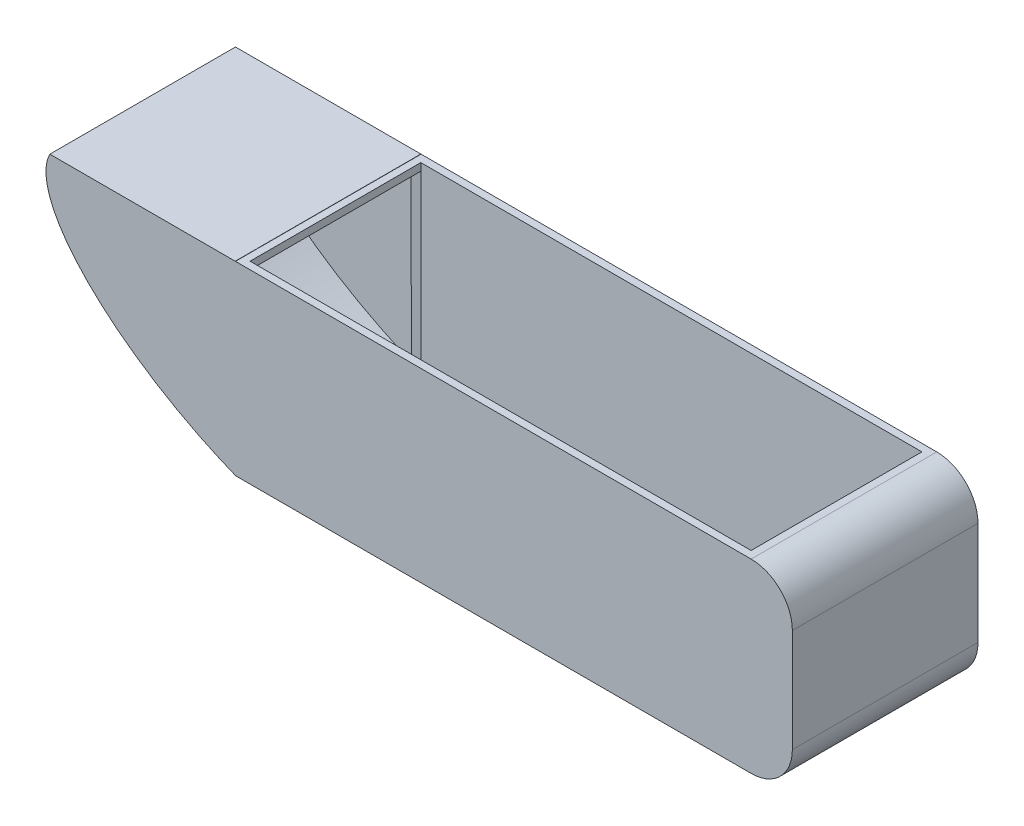
ISO-10303-21;
HEADER;
FILE_DESCRIPTION(('STEP AP214'),'2;1');
FILE_NAME('part.step','',(''),(''),'','','');
FILE_SCHEMA(('AUTOMOTIVE_DESIGN { 1 0 10303 214 1 1 1 1 }'));
ENDSEC;
DATA;
#1=APPLICATION_CONTEXT('core data for automotive mechanical design processes');
#2=APPLICATION_PROTOCOL_DEFINITION('international standard','automotive_design',2000,#1);
#3=PRODUCT_CONTEXT('',#1,'mechanical');
#4=PRODUCT('Part','Part','',(#3));
#5=PRODUCT_RELATED_PRODUCT_CATEGORY('part','',(#4));
#6=PRODUCT_DEFINITION_FORMATION('','',#4);
#7=PRODUCT_DEFINITION_CONTEXT('part definition',#1,'design');
#8=PRODUCT_DEFINITION('design','',#6,#7);
#9=PRODUCT_DEFINITION_SHAPE('','',#8);
#10=(LENGTH_UNIT() NAMED_UNIT(*) SI_UNIT(.MILLI.,.METRE.));
#11=(NAMED_UNIT(*) PLANE_ANGLE_UNIT() SI_UNIT($,.RADIAN.));
#12=(NAMED_UNIT(*) SI_UNIT($,.STERADIAN.) SOLID_ANGLE_UNIT());
#13=UNCERTAINTY_MEASURE_WITH_UNIT(LENGTH_MEASURE(1.E-05),#10,'distance_accuracy_value','');
#14=(GEOMETRIC_REPRESENTATION_CONTEXT(3) GLOBAL_UNCERTAINTY_ASSIGNED_CONTEXT((#13)) GLOBAL_UNIT_ASSIGNED_CONTEXT((#10,
#11,#12)) REPRESENTATION_CONTEXT('',''));
#15=CARTESIAN_POINT('',(0.,0.,0.));
#16=DIRECTION('',(0.,0.,1.));
#17=DIRECTION('',(1.,0.,0.));
#18=AXIS2_PLACEMENT_3D('',#15,#16,#17);
#19=CARTESIAN_POINT('',(0.,0.,250.));
#20=DIRECTION('',(-1.,0.,0.));
#21=DIRECTION('',(0.,0.,1.));
#22=AXIS2_PLACEMENT_3D('',#19,#20,#21);
#23=PLANE('',#22);
#24=DIRECTION('',(0.,1.,0.));
#25=VECTOR('',#24,1.);
#26=CARTESIAN_POINT('',(0.,0.,0.));
#27=LINE('',#26,#25);
#28=CARTESIAN_POINT('',(0.,249.866113842665,0.));
#29=VERTEX_POINT('',#28);
#30=CARTESIAN_POINT('',(0.,250.,0.));
#31=VERTEX_POINT('',#30);
#32=EDGE_CURVE('E215',#29,#31,#27,.T.);
#33=ORIENTED_EDGE('',*,*,#32,.F.);
#34=DIRECTION('',(0.,0.,-1.));
#35=VECTOR('',#34,1.);
#36=CARTESIAN_POINT('',(0.,249.866113842665,250.));
#37=LINE('',#36,#35);
#38=CARTESIAN_POINT('',(0.,249.866113842665,250.));
#39=VERTEX_POINT('',#38);
#40=EDGE_CURVE('E348',#39,#29,#37,.T.);
#41=ORIENTED_EDGE('',*,*,#40,.F.);
#42=DIRECTION('',(0.,1.,0.));
#43=VECTOR('',#42,1.);
#44=CARTESIAN_POINT('',(0.,0.,250.));
#45=LINE('',#44,#43);
#46=CARTESIAN_POINT('',(0.,250.,250.));
#47=VERTEX_POINT('',#46);
#48=EDGE_CURVE('E244',#39,#47,#45,.T.);
#49=ORIENTED_EDGE('',*,*,#48,.T.);
#50=DIRECTION('',(0.,0.,-1.));
#51=VECTOR('',#50,1.);
#52=CARTESIAN_POINT('',(0.,250.,250.));
#53=LINE('',#52,#51);
#54=EDGE_CURVE('E290',#47,#31,#53,.T.);
#55=ORIENTED_EDGE('',*,*,#54,.T.);
#56=EDGE_LOOP('',(#33,#41,#49,#55));
#57=FACE_BOUND('',#56,.T.);
#58=ADVANCED_FACE('F45',(#57),#23,.T.);
#59=CARTESIAN_POINT('',(0.,125.,250.));
#60=DIRECTION('',(0.,0.,1.));
#61=DIRECTION('',(-0.894427190999916,0.447213595499958,0.));
#62=AXIS2_PLACEMENT_3D('',#59,#60,#61);
#63=ELLIPSE('',#62,279.508497187474,113.981561352593);
#64=DIRECTION('',(0.,0.,-1.));
#65=VECTOR('',#64,1.);
#66=SURFACE_OF_LINEAR_EXTRUSION('',#63,#65);
#67=CARTESIAN_POINT('',(0.,125.,0.));
#68=DIRECTION('',(0.,0.,1.));
#69=DIRECTION('',(-0.894427190999916,0.447213595499958,0.));
#70=AXIS2_PLACEMENT_3D('',#67,#68,#69);
#71=ELLIPSE('',#70,279.508497187474,113.981561352593);
#72=CARTESIAN_POINT('',(-0.33480494875654,250.,0.));
#73=VERTEX_POINT('',#72);
#74=EDGE_CURVE('E294',#29,#73,#71,.T.);
#75=ORIENTED_EDGE('',*,*,#74,.T.);
#76=DIRECTION('',(0.,0.,-1.));
#77=VECTOR('',#76,1.);
#78=CARTESIAN_POINT('',(-0.33480494875654,250.,250.));
#79=LINE('',#78,#77);
#80=CARTESIAN_POINT('',(-0.33480494875654,250.,250.));
#81=VERTEX_POINT('',#80);
#82=EDGE_CURVE('E345',#81,#73,#79,.T.);
#83=ORIENTED_EDGE('',*,*,#82,.F.);
#84=EDGE_CURVE('E248',#39,#81,#63,.T.);
#85=ORIENTED_EDGE('',*,*,#84,.F.);
#86=ORIENTED_EDGE('',*,*,#40,.T.);
#87=EDGE_LOOP('',(#75,#83,#85,#86));
#88=FACE_BOUND('',#87,.T.);
#89=ADVANCED_FACE('F255',(#88),#66,.F.);
#90=CARTESIAN_POINT('',(0.,250.,250.));
#91=DIRECTION('',(0.,1.,0.));
#92=DIRECTION('',(0.,0.,1.));
#93=AXIS2_PLACEMENT_3D('',#90,#91,#92);
#94=PLANE('',#93);
#95=DIRECTION('',(1.,0.,0.));
#96=VECTOR('',#95,1.);
#97=CARTESIAN_POINT('',(0.,250.,0.));
#98=LINE('',#97,#96);
#99=CARTESIAN_POINT('',(-250.,250.,0.));
#100=VERTEX_POINT('',#99);
#101=EDGE_CURVE('E298',#100,#73,#98,.T.);
#102=ORIENTED_EDGE('',*,*,#101,.F.);
#103=DIRECTION('',(0.,0.,-1.));
#104=VECTOR('',#103,1.);
#105=CARTESIAN_POINT('',(-250.,250.,250.));
#106=LINE('',#105,#104);
#107=CARTESIAN_POINT('',(-250.,250.,250.));
#108=VERTEX_POINT('',#107);
#109=EDGE_CURVE('E342',#108,#100,#106,.T.);
#110=ORIENTED_EDGE('',*,*,#109,.F.);
#111=DIRECTION('',(1.,0.,0.));
#112=VECTOR('',#111,1.);
#113=CARTESIAN_POINT('',(0.,250.,250.));
#114=LINE('',#113,#112);
#115=EDGE_CURVE('E253',#108,#81,#114,.T.);
#116=ORIENTED_EDGE('',*,*,#115,.T.);
#117=ORIENTED_EDGE('',*,*,#82,.T.);
#118=EDGE_LOOP('',(#102,#110,#116,#117));
#119=FACE_BOUND('',#118,.T.);
#120=ADVANCED_FACE('F258',(#119),#94,.T.);
#121=CARTESIAN_POINT('',(0.,125.,250.));
#122=DIRECTION('',(0.,0.,1.));
#123=DIRECTION('',(-0.894427190999916,0.447213595499958,0.));
#124=AXIS2_PLACEMENT_3D('',#121,#122,#123);
#125=ELLIPSE('',#124,279.508497187474,113.981561352593);
#126=DIRECTION('',(0.,0.,-1.));
#127=VECTOR('',#126,1.);
#128=SURFACE_OF_LINEAR_EXTRUSION('',#125,#127);
#129=CARTESIAN_POINT('',(0.,125.,0.));
#130=DIRECTION('',(0.,0.,1.));
#131=DIRECTION('',(-0.894427190999916,0.447213595499958,0.));
#132=AXIS2_PLACEMENT_3D('',#129,#130,#131);
#133=ELLIPSE('',#132,279.508497187474,113.981561352593);
#134=CARTESIAN_POINT('',(0.33480494875654,0.,0.));
#135=VERTEX_POINT('',#134);
#136=EDGE_CURVE('E302',#100,#135,#133,.T.);
#137=ORIENTED_EDGE('',*,*,#136,.T.);
#138=DIRECTION('',(0.,0.,-1.));
#139=VECTOR('',#138,1.);
#140=CARTESIAN_POINT('',(0.33480494875654,0.,250.));
#141=LINE('',#140,#139);
#142=CARTESIAN_POINT('',(0.33480494875654,0.,250.));
#143=VERTEX_POINT('',#142);
#144=EDGE_CURVE('E338',#143,#135,#141,.T.);
#145=ORIENTED_EDGE('',*,*,#144,.F.);
#146=EDGE_CURVE('E269',#108,#143,#125,.T.);
#147=ORIENTED_EDGE('',*,*,#146,.F.);
#148=ORIENTED_EDGE('',*,*,#109,.T.);
#149=EDGE_LOOP('',(#137,#145,#147,#148));
#150=FACE_BOUND('',#149,.T.);
#151=ADVANCED_FACE('F262',(#150),#128,.F.);
#152=CARTESIAN_POINT('',(0.,0.,250.));
#153=DIRECTION('',(0.,1.,0.));
#154=DIRECTION('',(0.,0.,1.));
#155=AXIS2_PLACEMENT_3D('',#152,#153,#154);
#156=PLANE('',#155);
#157=DIRECTION('',(1.,0.,0.));
#158=VECTOR('',#157,1.);
#159=CARTESIAN_POINT('',(0.,0.,0.));
#160=LINE('',#159,#158);
#161=CARTESIAN_POINT('',(694.461299734421,0.,0.));
#162=VERTEX_POINT('',#161);
#163=EDGE_CURVE('E305',#135,#162,#160,.T.);
#164=ORIENTED_EDGE('',*,*,#163,.T.);
#165=DIRECTION('',(0.,0.,-1.));
#166=VECTOR('',#165,1.);
#167=CARTESIAN_POINT('',(694.461299734421,0.,250.));
#168=LINE('',#167,#166);
#169=CARTESIAN_POINT('',(694.461299734421,0.,250.));
#170=VERTEX_POINT('',#169);
#171=EDGE_CURVE('E334',#170,#162,#168,.T.);
#172=ORIENTED_EDGE('',*,*,#171,.F.);
#173=DIRECTION('',(1.,0.,0.));
#174=VECTOR('',#173,1.);
#175=CARTESIAN_POINT('',(0.,0.,250.));
#176=LINE('',#175,#174);
#177=EDGE_CURVE('E273',#143,#170,#176,.T.);
#178=ORIENTED_EDGE('',*,*,#177,.F.);
#179=ORIENTED_EDGE('',*,*,#144,.T.);
#180=EDGE_LOOP('',(#164,#172,#178,#179));
#181=FACE_BOUND('',#180,.T.);
#182=ADVANCED_FACE('F266',(#181),#156,.F.);
#183=CARTESIAN_POINT('',(694.461299734421,55.538700265579,250.));
#184=DIRECTION('',(0.,0.,-1.));
#185=DIRECTION('',(-1.,0.,0.));
#186=AXIS2_PLACEMENT_3D('',#183,#184,#185);
#187=CYLINDRICAL_SURFACE('',#186,55.538700265579);
#188=CARTESIAN_POINT('',(694.461299734421,55.538700265579,0.));
#189=DIRECTION('',(0.,0.,1.));
#190=DIRECTION('',(1.,0.,0.));
#191=AXIS2_PLACEMENT_3D('',#188,#189,#190);
#192=CIRCLE('',#191,55.538700265579);
#193=CARTESIAN_POINT('',(750.,55.5387002655794,0.));
#194=VERTEX_POINT('',#193);
#195=EDGE_CURVE('E308',#162,#194,#192,.T.);
#196=ORIENTED_EDGE('',*,*,#195,.T.);
#197=DIRECTION('',(0.,0.,-1.));
#198=VECTOR('',#197,1.);
#199=CARTESIAN_POINT('',(750.,55.5387002655794,250.));
#200=LINE('',#199,#198);
#201=CARTESIAN_POINT('',(750.,55.5387002655794,250.));
#202=VERTEX_POINT('',#201);
#203=EDGE_CURVE('E330',#202,#194,#200,.T.);
#204=ORIENTED_EDGE('',*,*,#203,.F.);
#205=CARTESIAN_POINT('',(694.461299734421,55.538700265579,250.));
#206=DIRECTION('',(0.,0.,1.));
#207=DIRECTION('',(1.,0.,0.));
#208=AXIS2_PLACEMENT_3D('',#205,#206,#207);
#209=CIRCLE('',#208,55.538700265579);
#210=EDGE_CURVE('E276',#170,#202,#209,.T.);
#211=ORIENTED_EDGE('',*,*,#210,.F.);
#212=ORIENTED_EDGE('',*,*,#171,.T.);
#213=EDGE_LOOP('',(#196,#204,#211,#212));
#214=FACE_BOUND('',#213,.T.);
#215=ADVANCED_FACE('F454',(#214),#187,.T.);
#216=CARTESIAN_POINT('',(750.,0.,250.));
#217=DIRECTION('',(-1.,0.,0.));
#218=DIRECTION('',(0.,0.,1.));
#219=AXIS2_PLACEMENT_3D('',#216,#217,#218);
#220=PLANE('',#219);
#221=DIRECTION('',(0.,1.,0.));
#222=VECTOR('',#221,1.);
#223=CARTESIAN_POINT('',(750.,0.,0.));
#224=LINE('',#223,#222);
#225=CARTESIAN_POINT('',(750.,194.461299734421,0.));
#226=VERTEX_POINT('',#225);
#227=EDGE_CURVE('E311',#194,#226,#224,.T.);
#228=ORIENTED_EDGE('',*,*,#227,.T.);
#229=DIRECTION('',(0.,0.,-1.));
#230=VECTOR('',#229,1.);
#231=CARTESIAN_POINT('',(750.,194.461299734421,250.));
#232=LINE('',#231,#230);
#233=CARTESIAN_POINT('',(750.,194.461299734421,250.));
#234=VERTEX_POINT('',#233);
#235=EDGE_CURVE('E327',#234,#226,#232,.T.);
#236=ORIENTED_EDGE('',*,*,#235,.F.);
#237=DIRECTION('',(0.,1.,0.));
#238=VECTOR('',#237,1.);
#239=CARTESIAN_POINT('',(750.,0.,250.));
#240=LINE('',#239,#238);
#241=EDGE_CURVE('E279',#202,#234,#240,.T.);
#242=ORIENTED_EDGE('',*,*,#241,.F.);
#243=ORIENTED_EDGE('',*,*,#203,.T.);
#244=EDGE_LOOP('',(#228,#236,#242,#243));
#245=FACE_BOUND('',#244,.T.);
#246=ADVANCED_FACE('F451',(#245),#220,.F.);
#247=CARTESIAN_POINT('',(694.461299734421,194.461299734421,250.));
#248=DIRECTION('',(0.,0.,-1.));
#249=DIRECTION('',(-1.,0.,0.));
#250=AXIS2_PLACEMENT_3D('',#247,#248,#249);
#251=CYLINDRICAL_SURFACE('',#250,55.538700265579);
#252=CARTESIAN_POINT('',(694.461299734421,194.461299734421,0.));
#253=DIRECTION('',(0.,0.,1.));
#254=DIRECTION('',(1.,0.,0.));
#255=AXIS2_PLACEMENT_3D('',#252,#253,#254);
#256=CIRCLE('',#255,55.538700265579);
#257=CARTESIAN_POINT('',(694.461299734421,250.,0.));
#258=VERTEX_POINT('',#257);
#259=EDGE_CURVE('E315',#258,#226,#256,.F.);
#260=ORIENTED_EDGE('',*,*,#259,.F.);
#261=DIRECTION('',(0.,0.,-1.));
#262=VECTOR('',#261,1.);
#263=CARTESIAN_POINT('',(694.461299734421,250.,250.));
#264=LINE('',#263,#262);
#265=CARTESIAN_POINT('',(694.461299734421,250.,250.));
#266=VERTEX_POINT('',#265);
#267=EDGE_CURVE('E324',#266,#258,#264,.T.);
#268=ORIENTED_EDGE('',*,*,#267,.F.);
#269=CARTESIAN_POINT('',(694.461299734421,194.461299734421,250.));
#270=DIRECTION('',(0.,0.,1.));
#271=DIRECTION('',(1.,0.,0.));
#272=AXIS2_PLACEMENT_3D('',#269,#270,#271);
#273=CIRCLE('',#272,55.538700265579);
#274=EDGE_CURVE('E282',#266,#234,#273,.F.);
#275=ORIENTED_EDGE('',*,*,#274,.T.);
#276=ORIENTED_EDGE('',*,*,#235,.T.);
#277=EDGE_LOOP('',(#260,#268,#275,#276));
#278=FACE_BOUND('',#277,.T.);
#279=ADVANCED_FACE('F447',(#278),#251,.T.);
#280=CARTESIAN_POINT('',(0.,250.,250.));
#281=DIRECTION('',(0.,1.,0.));
#282=DIRECTION('',(0.,0.,1.));
#283=AXIS2_PLACEMENT_3D('',#280,#281,#282);
#284=PLANE('',#283);
#285=DIRECTION('',(0.,0.,1.));
#286=VECTOR('',#285,1.);
#287=CARTESIAN_POINT('',(9.66519505124346,250.,10.));
#288=LINE('',#287,#286);
#289=CARTESIAN_POINT('',(9.66519505124346,250.,10.));
#290=VERTEX_POINT('',#289);
#291=CARTESIAN_POINT('',(9.66519505124349,250.,240.));
#292=VERTEX_POINT('',#291);
#293=EDGE_CURVE('E711',#290,#292,#288,.T.);
#294=ORIENTED_EDGE('',*,*,#293,.F.);
#295=DIRECTION('',(-1.,0.,0.));
#296=VECTOR('',#295,1.);
#297=CARTESIAN_POINT('',(9.66519505124346,250.,10.));
#298=LINE('',#297,#296);
#299=CARTESIAN_POINT('',(684.461299734421,250.,10.));
#300=VERTEX_POINT('',#299);
#301=EDGE_CURVE('E225',#300,#290,#298,.T.);
#302=ORIENTED_EDGE('',*,*,#301,.F.);
#303=DIRECTION('',(0.,0.,-1.));
#304=VECTOR('',#303,1.);
#305=CARTESIAN_POINT('',(684.461299734421,250.,10.));
#306=LINE('',#305,#304);
#307=CARTESIAN_POINT('',(684.461299734421,250.,240.));
#308=VERTEX_POINT('',#307);
#309=EDGE_CURVE('E756',#308,#300,#306,.T.);
#310=ORIENTED_EDGE('',*,*,#309,.F.);
#311=DIRECTION('',(1.,0.,0.));
#312=VECTOR('',#311,1.);
#313=CARTESIAN_POINT('',(9.66519505124349,250.,240.));
#314=LINE('',#313,#312);
#315=EDGE_CURVE('E754',#292,#308,#314,.T.);
#316=ORIENTED_EDGE('',*,*,#315,.F.);
#317=EDGE_LOOP('',(#294,#302,#310,#316));
#318=FACE_BOUND('',#317,.T.);
#319=DIRECTION('',(1.,0.,0.));
#320=VECTOR('',#319,1.);
#321=CARTESIAN_POINT('',(0.,250.,0.));
#322=LINE('',#321,#320);
#323=EDGE_CURVE('E249',#31,#258,#322,.T.);
#324=ORIENTED_EDGE('',*,*,#323,.F.);
#325=ORIENTED_EDGE('',*,*,#54,.F.);
#326=DIRECTION('',(1.,0.,0.));
#327=VECTOR('',#326,1.);
#328=CARTESIAN_POINT('',(0.,250.,250.));
#329=LINE('',#328,#327);
#330=EDGE_CURVE('E286',#47,#266,#329,.T.);
#331=ORIENTED_EDGE('',*,*,#330,.T.);
#332=ORIENTED_EDGE('',*,*,#267,.T.);
#333=EDGE_LOOP('',(#324,#325,#331,#332));
#334=FACE_BOUND('',#333,.T.);
#335=ADVANCED_FACE('F440',(#318,#334),#284,.T.);
#336=CARTESIAN_POINT('',(0.,0.,250.));
#337=DIRECTION('',(0.,0.,1.));
#338=DIRECTION('',(1.,0.,0.));
#339=AXIS2_PLACEMENT_3D('',#336,#337,#338);
#340=PLANE('',#339);
#341=ORIENTED_EDGE('',*,*,#48,.F.);
#342=ORIENTED_EDGE('',*,*,#84,.T.);
#343=ORIENTED_EDGE('',*,*,#115,.F.);
#344=ORIENTED_EDGE('',*,*,#146,.T.);
#345=ORIENTED_EDGE('',*,*,#177,.T.);
#346=ORIENTED_EDGE('',*,*,#210,.T.);
#347=ORIENTED_EDGE('',*,*,#241,.T.);
#348=ORIENTED_EDGE('',*,*,#274,.F.);
#349=ORIENTED_EDGE('',*,*,#330,.F.);
#350=EDGE_LOOP('',(#341,#342,#343,#344,#345,#346,#347,#348,#349));
#351=FACE_BOUND('',#350,.T.);
#352=ADVANCED_FACE('F437',(#351),#340,.T.);
#353=CARTESIAN_POINT('',(0.,0.,0.));
#354=DIRECTION('',(0.,0.,1.));
#355=DIRECTION('',(1.,0.,0.));
#356=AXIS2_PLACEMENT_3D('',#353,#354,#355);
#357=PLANE('',#356);
#358=ORIENTED_EDGE('',*,*,#32,.T.);
#359=ORIENTED_EDGE('',*,*,#323,.T.);
#360=ORIENTED_EDGE('',*,*,#259,.T.);
#361=ORIENTED_EDGE('',*,*,#227,.F.);
#362=ORIENTED_EDGE('',*,*,#195,.F.);
#363=ORIENTED_EDGE('',*,*,#163,.F.);
#364=ORIENTED_EDGE('',*,*,#136,.F.);
#365=ORIENTED_EDGE('',*,*,#101,.T.);
#366=ORIENTED_EDGE('',*,*,#74,.F.);
#367=EDGE_LOOP('',(#358,#359,#360,#361,#362,#363,#364,#365,#366));
#368=FACE_BOUND('',#367,.T.);
#369=ADVANCED_FACE('F436',(#368),#357,.F.);
#370=CARTESIAN_POINT('',(9.66519505124346,10.,10.));
#371=DIRECTION('',(-1.,0.,0.));
#372=DIRECTION('',(0.,0.,1.));
#373=AXIS2_PLACEMENT_3D('',#370,#371,#372);
#374=PLANE('',#373);
#375=DIRECTION('',(0.,1.,0.));
#376=VECTOR('',#375,1.);
#377=CARTESIAN_POINT('',(9.66519505124349,10.,240.));
#378=LINE('',#377,#376);
#379=CARTESIAN_POINT('',(9.66519505124349,240.,240.));
#380=VERTEX_POINT('',#379);
#381=EDGE_CURVE('E68',#380,#292,#378,.T.);
#382=ORIENTED_EDGE('',*,*,#381,.F.);
#383=DIRECTION('',(0.,0.,1.));
#384=VECTOR('',#383,1.);
#385=CARTESIAN_POINT('',(9.66519505124346,240.,10.0000000000001));
#386=LINE('',#385,#384);
#387=CARTESIAN_POINT('',(9.66519505124346,240.,10.0000000000001));
#388=VERTEX_POINT('',#387);
#389=EDGE_CURVE('E198',#388,#380,#386,.T.);
#390=ORIENTED_EDGE('',*,*,#389,.F.);
#391=DIRECTION('',(0.,1.,0.));
#392=VECTOR('',#391,1.);
#393=CARTESIAN_POINT('',(9.66519505124346,10.,10.));
#394=LINE('',#393,#392);
#395=EDGE_CURVE('E216',#388,#290,#394,.T.);
#396=ORIENTED_EDGE('',*,*,#395,.T.);
#397=ORIENTED_EDGE('',*,*,#293,.T.);
#398=EDGE_LOOP('',(#382,#390,#396,#397));
#399=FACE_BOUND('',#398,.T.);
#400=ADVANCED_FACE('F219',(#399),#374,.F.);
#401=CARTESIAN_POINT('',(9.66519505124346,10.,10.));
#402=DIRECTION('',(0.,0.,-1.));
#403=DIRECTION('',(-1.,0.,0.));
#404=AXIS2_PLACEMENT_3D('',#401,#402,#403);
#405=PLANE('',#404);
#406=ORIENTED_EDGE('',*,*,#301,.T.);
#407=ORIENTED_EDGE('',*,*,#395,.F.);
#408=CARTESIAN_POINT('',(9.66519505124346,10.,10.0000000000001));
#409=VERTEX_POINT('',#408);
#410=EDGE_CURVE('E205',#409,#388,#394,.T.);
#411=ORIENTED_EDGE('',*,*,#410,.F.);
#412=DIRECTION('',(-1.,0.,0.));
#413=VECTOR('',#412,1.);
#414=CARTESIAN_POINT('',(9.66519505124346,10.,10.));
#415=LINE('',#414,#413);
#416=CARTESIAN_POINT('',(684.461299734421,10.,10.));
#417=VERTEX_POINT('',#416);
#418=EDGE_CURVE('E749',#417,#409,#415,.T.);
#419=ORIENTED_EDGE('',*,*,#418,.F.);
#420=DIRECTION('',(0.,1.,0.));
#421=VECTOR('',#420,1.);
#422=CARTESIAN_POINT('',(684.461299734421,10.,10.));
#423=LINE('',#422,#421);
#424=CARTESIAN_POINT('',(684.461299734421,240.,9.99999999999999));
#425=VERTEX_POINT('',#424);
#426=EDGE_CURVE('E228',#417,#425,#423,.T.);
#427=ORIENTED_EDGE('',*,*,#426,.T.);
#428=EDGE_CURVE('E231',#425,#300,#423,.T.);
#429=ORIENTED_EDGE('',*,*,#428,.T.);
#430=EDGE_LOOP('',(#406,#407,#411,#419,#427,#429));
#431=FACE_BOUND('',#430,.T.);
#432=ADVANCED_FACE('F223',(#431),#405,.F.);
#433=CARTESIAN_POINT('',(684.461299734421,10.,10.));
#434=DIRECTION('',(1.,0.,0.));
#435=DIRECTION('',(0.,0.,-1.));
#436=AXIS2_PLACEMENT_3D('',#433,#434,#435);
#437=PLANE('',#436);
#438=ORIENTED_EDGE('',*,*,#428,.F.);
#439=DIRECTION('',(0.,0.,-1.));
#440=VECTOR('',#439,1.);
#441=CARTESIAN_POINT('',(684.461299734421,240.,9.99999999999999));
#442=LINE('',#441,#440);
#443=CARTESIAN_POINT('',(684.461299734421,240.,240.));
#444=VERTEX_POINT('',#443);
#445=EDGE_CURVE('E698',#444,#425,#442,.T.);
#446=ORIENTED_EDGE('',*,*,#445,.F.);
#447=DIRECTION('',(0.,1.,0.));
#448=VECTOR('',#447,1.);
#449=CARTESIAN_POINT('',(684.461299734421,10.,240.));
#450=LINE('',#449,#448);
#451=EDGE_CURVE('E240',#444,#308,#450,.T.);
#452=ORIENTED_EDGE('',*,*,#451,.T.);
#453=ORIENTED_EDGE('',*,*,#309,.T.);
#454=EDGE_LOOP('',(#438,#446,#452,#453));
#455=FACE_BOUND('',#454,.T.);
#456=ADVANCED_FACE('F428',(#455),#437,.F.);
#457=CARTESIAN_POINT('',(9.66519505124349,10.,240.));
#458=DIRECTION('',(0.,0.,1.));
#459=DIRECTION('',(1.,0.,0.));
#460=AXIS2_PLACEMENT_3D('',#457,#458,#459);
#461=PLANE('',#460);
#462=ORIENTED_EDGE('',*,*,#315,.T.);
#463=ORIENTED_EDGE('',*,*,#451,.F.);
#464=CARTESIAN_POINT('',(684.461299734421,10.,240.));
#465=VERTEX_POINT('',#464);
#466=EDGE_CURVE('E236',#465,#444,#450,.T.);
#467=ORIENTED_EDGE('',*,*,#466,.F.);
#468=DIRECTION('',(1.,0.,0.));
#469=VECTOR('',#468,1.);
#470=CARTESIAN_POINT('',(9.66519505124349,10.,240.));
#471=LINE('',#470,#469);
#472=CARTESIAN_POINT('',(9.66519505124349,10.,240.));
#473=VERTEX_POINT('',#472);
#474=EDGE_CURVE('E741',#473,#465,#471,.T.);
#475=ORIENTED_EDGE('',*,*,#474,.F.);
#476=EDGE_CURVE('E241',#473,#380,#378,.T.);
#477=ORIENTED_EDGE('',*,*,#476,.T.);
#478=ORIENTED_EDGE('',*,*,#381,.T.);
#479=EDGE_LOOP('',(#462,#463,#467,#475,#477,#478));
#480=FACE_BOUND('',#479,.T.);
#481=ADVANCED_FACE('F424',(#480),#461,.F.);
#482=CARTESIAN_POINT('',(0.,10.,0.));
#483=DIRECTION('',(0.,1.,0.));
#484=DIRECTION('',(0.,0.,1.));
#485=AXIS2_PLACEMENT_3D('',#482,#483,#484);
#486=PLANE('',#485);
#487=DIRECTION('',(0.,0.,1.));
#488=VECTOR('',#487,1.);
#489=CARTESIAN_POINT('',(9.66519505124346,10.,10.));
#490=LINE('',#489,#488);
#491=EDGE_CURVE('E737',#409,#473,#490,.T.);
#492=ORIENTED_EDGE('',*,*,#491,.T.);
#493=ORIENTED_EDGE('',*,*,#474,.T.);
#494=DIRECTION('',(0.,0.,-1.));
#495=VECTOR('',#494,1.);
#496=CARTESIAN_POINT('',(684.461299734421,10.,10.));
#497=LINE('',#496,#495);
#498=EDGE_CURVE('E745',#465,#417,#497,.T.);
#499=ORIENTED_EDGE('',*,*,#498,.T.);
#500=ORIENTED_EDGE('',*,*,#418,.T.);
#501=EDGE_LOOP('',(#492,#493,#499,#500));
#502=FACE_BOUND('',#501,.T.);
#503=ADVANCED_FACE('F410',(#502),#486,.T.);
#504=CARTESIAN_POINT('',(684.461299734421,240.,9.99999999999999));
#505=DIRECTION('',(0.913545457642601,0.,-0.406736643075799));
#506=DIRECTION('',(-0.406736643075799,0.,-0.913545457642601));
#507=AXIS2_PLACEMENT_3D('',#504,#505,#506);
#508=PLANE('',#507);
#509=ORIENTED_EDGE('',*,*,#426,.F.);
#510=DIRECTION('',(-0.300294039609495,-0.674471455947178,-0.674471455947178));
#511=VECTOR('',#510,1.);
#512=CARTESIAN_POINT('',(731.045444099186,114.629701324126,114.629701324126));
#513=LINE('',#512,#511);
#514=CARTESIAN_POINT('',(724.461299734421,99.841470956169,99.841470956169));
#515=VERTEX_POINT('',#514);
#516=EDGE_CURVE('E713',#515,#417,#513,.T.);
#517=ORIENTED_EDGE('',*,*,#516,.F.);
#518=DIRECTION('',(0.,-1.,0.));
#519=VECTOR('',#518,1.);
#520=CARTESIAN_POINT('',(724.461299734421,0.,99.841470956169));
#521=LINE('',#520,#519);
#522=CARTESIAN_POINT('',(724.461299734421,150.158529043831,99.841470956169));
#523=VERTEX_POINT('',#522);
#524=EDGE_CURVE('E707',#523,#515,#521,.T.);
#525=ORIENTED_EDGE('',*,*,#524,.F.);
#526=DIRECTION('',(-0.300294039609495,0.674471455947178,-0.674471455947178));
#527=VECTOR('',#526,1.);
#528=CARTESIAN_POINT('',(684.461299734421,240.,9.99999999999999));
#529=LINE('',#528,#527);
#530=EDGE_CURVE('E708',#523,#425,#529,.T.);
#531=ORIENTED_EDGE('',*,*,#530,.T.);
#532=EDGE_LOOP('',(#509,#517,#525,#531));
#533=FACE_BOUND('',#532,.T.);
#534=ADVANCED_FACE('F406',(#533),#508,.F.);
#535=CARTESIAN_POINT('',(684.461299734421,240.,9.99999999999999));
#536=DIRECTION('',(0.913545457642601,0.406736643075799,0.));
#537=DIRECTION('',(-0.406736643075799,0.913545457642601,0.));
#538=AXIS2_PLACEMENT_3D('',#535,#536,#537);
#539=PLANE('',#538);
#540=ORIENTED_EDGE('',*,*,#445,.T.);
#541=ORIENTED_EDGE('',*,*,#530,.F.);
#542=DIRECTION('',(0.,0.,-1.));
#543=VECTOR('',#542,1.);
#544=CARTESIAN_POINT('',(724.461299734421,150.158529043831,0.));
#545=LINE('',#544,#543);
#546=CARTESIAN_POINT('',(724.461299734421,150.158529043831,150.158529043831));
#547=VERTEX_POINT('',#546);
#548=EDGE_CURVE('E718',#547,#523,#545,.T.);
#549=ORIENTED_EDGE('',*,*,#548,.F.);
#550=DIRECTION('',(-0.300294039609495,0.674471455947178,0.674471455947177));
#551=VECTOR('',#550,1.);
#552=CARTESIAN_POINT('',(684.461299734421,240.,240.));
#553=LINE('',#552,#551);
#554=EDGE_CURVE('E712',#547,#444,#553,.T.);
#555=ORIENTED_EDGE('',*,*,#554,.T.);
#556=EDGE_LOOP('',(#540,#541,#549,#555));
#557=FACE_BOUND('',#556,.T.);
#558=ADVANCED_FACE('F409',(#557),#539,.F.);
#559=CARTESIAN_POINT('',(684.461299734421,240.,240.));
#560=DIRECTION('',(0.913545457642601,0.,0.406736643075799));
#561=DIRECTION('',(0.406736643075799,0.,-0.913545457642601));
#562=AXIS2_PLACEMENT_3D('',#559,#560,#561);
#563=PLANE('',#562);
#564=ORIENTED_EDGE('',*,*,#466,.T.);
#565=ORIENTED_EDGE('',*,*,#554,.F.);
#566=DIRECTION('',(0.,1.,0.));
#567=VECTOR('',#566,1.);
#568=CARTESIAN_POINT('',(724.461299734421,0.,150.158529043831));
#569=LINE('',#568,#567);
#570=CARTESIAN_POINT('',(724.461299734421,99.841470956169,150.158529043831));
#571=VERTEX_POINT('',#570);
#572=EDGE_CURVE('E730',#571,#547,#569,.T.);
#573=ORIENTED_EDGE('',*,*,#572,.F.);
#574=DIRECTION('',(-0.300294039609495,-0.674471455947177,0.674471455947178));
#575=VECTOR('',#574,1.);
#576=CARTESIAN_POINT('',(731.045444099186,114.629701324126,135.370298675874));
#577=LINE('',#576,#575);
#578=EDGE_CURVE('E717',#571,#465,#577,.T.);
#579=ORIENTED_EDGE('',*,*,#578,.T.);
#580=EDGE_LOOP('',(#564,#565,#573,#579));
#581=FACE_BOUND('',#580,.T.);
#582=ADVANCED_FACE('F414',(#581),#563,.F.);
#583=CARTESIAN_POINT('',(684.461299734421,10.,10.));
#584=DIRECTION('',(0.913545457642601,-0.406736643075799,0.));
#585=DIRECTION('',(0.406736643075799,0.913545457642601,0.));
#586=AXIS2_PLACEMENT_3D('',#583,#584,#585);
#587=PLANE('',#586);
#588=ORIENTED_EDGE('',*,*,#498,.F.);
#589=ORIENTED_EDGE('',*,*,#578,.F.);
#590=DIRECTION('',(0.,0.,1.));
#591=VECTOR('',#590,1.);
#592=CARTESIAN_POINT('',(724.461299734421,99.841470956169,0.));
#593=LINE('',#592,#591);
#594=EDGE_CURVE('E726',#515,#571,#593,.T.);
#595=ORIENTED_EDGE('',*,*,#594,.F.);
#596=ORIENTED_EDGE('',*,*,#516,.T.);
#597=EDGE_LOOP('',(#588,#589,#595,#596));
#598=FACE_BOUND('',#597,.T.);
#599=ADVANCED_FACE('F404',(#598),#587,.F.);
#600=CARTESIAN_POINT('',(724.461299734421,0.,0.));
#601=DIRECTION('',(-1.,0.,0.));
#602=DIRECTION('',(0.,0.,1.));
#603=AXIS2_PLACEMENT_3D('',#600,#601,#602);
#604=PLANE('',#603);
#605=ORIENTED_EDGE('',*,*,#524,.T.);
#606=ORIENTED_EDGE('',*,*,#594,.T.);
#607=ORIENTED_EDGE('',*,*,#572,.T.);
#608=ORIENTED_EDGE('',*,*,#548,.T.);
#609=EDGE_LOOP('',(#605,#606,#607,#608));
#610=FACE_BOUND('',#609,.T.);
#611=ADVANCED_FACE('F401',(#610),#604,.T.);
#612=CARTESIAN_POINT('',(9.66519505124346,10.,10.0000000000001));
#613=DIRECTION('',(-0.342020143325669,0.,-0.939692620785908));
#614=DIRECTION('',(-0.939692620785908,0.,0.342020143325669));
#615=AXIS2_PLACEMENT_3D('',#612,#613,#614);
#616=PLANE('',#615);
#617=DIRECTION('',(0.889126490715988,-0.323615577118185,-0.323615577118185));
#618=VECTOR('',#617,1.);
#619=CARTESIAN_POINT('',(9.66519505124346,10.,10.0000000000001));
#620=LINE('',#619,#618);
#621=CARTESIAN_POINT('',(0.316856032495919,13.4025171426534,13.4025171426535));
#622=VERTEX_POINT('',#621);
#623=EDGE_CURVE('E208',#622,#409,#620,.T.);
#624=ORIENTED_EDGE('',*,*,#623,.T.);
#625=ORIENTED_EDGE('',*,*,#410,.T.);
#626=DIRECTION('',(0.889126490715988,0.323615577118185,-0.323615577118185));
#627=VECTOR('',#626,1.);
#628=CARTESIAN_POINT('',(-56.5138969063044,215.912780396687,34.0872196033134));
#629=LINE('',#628,#627);
#630=CARTESIAN_POINT('',(0.0180945434084014,236.488742568174,13.5112574318264));
#631=VERTEX_POINT('',#630);
#632=EDGE_CURVE('E194',#631,#388,#629,.T.);
#633=ORIENTED_EDGE('',*,*,#632,.F.);
#634=DIRECTION('',(-0.00133921843498111,0.999998984449721,0.000487435647513694));
#635=VECTOR('',#634,1.);
#636=CARTESIAN_POINT('',(0.0133944791464865,239.99829662298,13.5129681153169));
#637=LINE('',#636,#635);
#638=EDGE_CURVE('E11',#622,#631,#637,.T.);
#639=ORIENTED_EDGE('',*,*,#638,.F.);
#640=EDGE_LOOP('',(#624,#625,#633,#639));
#641=FACE_BOUND('',#640,.T.);
#642=ADVANCED_FACE('F206',(#641),#616,.F.);
#643=CARTESIAN_POINT('',(9.66519505124346,10.,10.0000000000001));
#644=DIRECTION('',(-0.342020143325669,-0.939692620785908,0.));
#645=DIRECTION('',(0.939692620785908,-0.342020143325669,0.));
#646=AXIS2_PLACEMENT_3D('',#643,#644,#645);
#647=PLANE('',#646);
#648=DIRECTION('',(0.889126490715988,-0.323615577118185,0.323615577118185));
#649=VECTOR('',#648,1.);
#650=CARTESIAN_POINT('',(9.66519505124349,9.99999999999997,240.));
#651=LINE('',#650,#649);
#652=CARTESIAN_POINT('',(0.316856032495934,13.4025171426534,236.597482857347));
#653=VERTEX_POINT('',#652);
#654=EDGE_CURVE('E365',#653,#473,#651,.T.);
#655=ORIENTED_EDGE('',*,*,#654,.T.);
#656=ORIENTED_EDGE('',*,*,#491,.F.);
#657=ORIENTED_EDGE('',*,*,#623,.F.);
#658=DIRECTION('',(0.,0.,-1.));
#659=VECTOR('',#658,1.);
#660=CARTESIAN_POINT('',(0.316856032495921,13.4025171426534,9.99999999999996));
#661=LINE('',#660,#659);
#662=EDGE_CURVE('E53',#653,#622,#661,.T.);
#663=ORIENTED_EDGE('',*,*,#662,.F.);
#664=EDGE_LOOP('',(#655,#656,#657,#663));
#665=FACE_BOUND('',#664,.T.);
#666=ADVANCED_FACE('F364',(#665),#647,.F.);
#667=CARTESIAN_POINT('',(9.66519505124349,9.99999999999997,240.));
#668=DIRECTION('',(-0.342020143325669,0.,0.939692620785908));
#669=DIRECTION('',(0.939692620785908,0.,0.342020143325669));
#670=AXIS2_PLACEMENT_3D('',#667,#668,#669);
#671=PLANE('',#670);
#672=DIRECTION('',(0.889126490715988,0.323615577118185,0.323615577118185));
#673=VECTOR('',#672,1.);
#674=CARTESIAN_POINT('',(-56.5138969063044,215.912780396687,215.912780396687));
#675=LINE('',#674,#673);
#676=CARTESIAN_POINT('',(0.0180945434083979,236.488742568174,236.488742568174));
#677=VERTEX_POINT('',#676);
#678=EDGE_CURVE('E60',#677,#380,#675,.T.);
#679=ORIENTED_EDGE('',*,*,#678,.T.);
#680=ORIENTED_EDGE('',*,*,#476,.F.);
#681=ORIENTED_EDGE('',*,*,#654,.F.);
#682=DIRECTION('',(0.00133921843498111,-0.999998984449721,0.000487435647513694));
#683=VECTOR('',#682,1.);
#684=CARTESIAN_POINT('',(0.0132443391013325,240.110406708055,236.486977238176));
#685=LINE('',#684,#683);
#686=EDGE_CURVE('E353',#677,#653,#685,.T.);
#687=ORIENTED_EDGE('',*,*,#686,.F.);
#688=EDGE_LOOP('',(#679,#680,#681,#687));
#689=FACE_BOUND('',#688,.T.);
#690=ADVANCED_FACE('F368',(#689),#671,.F.);
#691=CARTESIAN_POINT('',(9.66519505124346,240.,10.0000000000001));
#692=DIRECTION('',(-0.342020143325669,0.939692620785908,0.));
#693=DIRECTION('',(-0.939692620785908,-0.342020143325669,0.));
#694=AXIS2_PLACEMENT_3D('',#691,#692,#693);
#695=PLANE('',#694);
#696=ORIENTED_EDGE('',*,*,#632,.T.);
#697=ORIENTED_EDGE('',*,*,#389,.T.);
#698=ORIENTED_EDGE('',*,*,#678,.F.);
#699=DIRECTION('',(0.,0.,1.));
#700=VECTOR('',#699,1.);
#701=CARTESIAN_POINT('',(0.0180945434083979,236.488742568174,9.99999999999998));
#702=LINE('',#701,#700);
#703=EDGE_CURVE('E200',#631,#677,#702,.T.);
#704=ORIENTED_EDGE('',*,*,#703,.F.);
#705=EDGE_LOOP('',(#696,#697,#698,#704));
#706=FACE_BOUND('',#705,.T.);
#707=ADVANCED_FACE('F196',(#706),#695,.F.);
#708=CARTESIAN_POINT('',(0.0133921859407614,240.000008967536,9.99999999999998));
#709=DIRECTION('',(-3.63878662633006E-08,0.999999999999999,0.));
#710=DIRECTION('',(-0.999999999999999,-3.63878662633006E-08,0.));
#711=AXIS2_PLACEMENT_3D('',#708,#709,#710);
#712=PLANE('',#711);
#713=DIRECTION('',(-0.999999999999999,-3.63878662633006E-08,0.));
#714=VECTOR('',#713,1.);
#715=CARTESIAN_POINT('',(0.0133921859407614,240.000008967536,240.));
#716=LINE('',#715,#714);
#717=CARTESIAN_POINT('',(0.0133921859407614,240.000008967536,240.));
#718=VERTEX_POINT('',#717);
#719=CARTESIAN_POINT('',(-243.578112703287,240.000000103761,240.));
#720=VERTEX_POINT('',#719);
#721=EDGE_CURVE('E373',#718,#720,#716,.T.);
#722=ORIENTED_EDGE('',*,*,#721,.T.);
#723=DIRECTION('',(0.,0.,1.));
#724=VECTOR('',#723,1.);
#725=CARTESIAN_POINT('',(-243.578112703287,240.000000103761,9.99999999999998));
#726=LINE('',#725,#724);
#727=CARTESIAN_POINT('',(-243.578112703287,240.000000103761,9.99999999999998));
#728=VERTEX_POINT('',#727);
#729=EDGE_CURVE('E701',#728,#720,#726,.T.);
#730=ORIENTED_EDGE('',*,*,#729,.F.);
#731=DIRECTION('',(-0.999999999999999,-3.63878662633006E-08,0.));
#732=VECTOR('',#731,1.);
#733=CARTESIAN_POINT('',(0.0133921859407614,240.000008967536,9.99999999999998));
#734=LINE('',#733,#732);
#735=CARTESIAN_POINT('',(0.0133921859407614,240.000008967536,9.99999999999998));
#736=VERTEX_POINT('',#735);
#737=EDGE_CURVE('E377',#736,#728,#734,.T.);
#738=ORIENTED_EDGE('',*,*,#737,.F.);
#739=DIRECTION('',(0.,0.,1.));
#740=VECTOR('',#739,1.);
#741=CARTESIAN_POINT('',(0.0133921859407614,240.000008967536,9.99999999999998));
#742=LINE('',#741,#740);
#743=EDGE_CURVE('E688',#736,#718,#742,.T.);
#744=ORIENTED_EDGE('',*,*,#743,.T.);
#745=EDGE_LOOP('',(#722,#730,#738,#744));
#746=FACE_BOUND('',#745,.T.);
#747=ADVANCED_FACE('F397',(#746),#712,.F.);
#748=CARTESIAN_POINT('',(0.0133921859407614,240.000008967536,9.99999999999998));
#749=DIRECTION('',(0.999999103246377,0.00133921859407595,0.));
#750=DIRECTION('',(-0.00133921859407595,0.999999103246377,0.));
#751=AXIS2_PLACEMENT_3D('',#748,#749,#750);
#752=PLANE('',#751);
#753=ORIENTED_EDGE('',*,*,#662,.T.);
#754=ORIENTED_EDGE('',*,*,#638,.T.);
#755=ORIENTED_EDGE('',*,*,#703,.T.);
#756=ORIENTED_EDGE('',*,*,#686,.T.);
#757=EDGE_LOOP('',(#753,#754,#755,#756));
#758=FACE_BOUND('',#757,.T.);
#759=DIRECTION('',(-0.00133921859407595,0.999999103246377,0.));
#760=VECTOR('',#759,1.);
#761=CARTESIAN_POINT('',(0.0133921859407614,240.000008967536,240.));
#762=LINE('',#761,#760);
#763=CARTESIAN_POINT('',(0.321682976131617,9.7982218256162,240.));
#764=VERTEX_POINT('',#763);
#765=EDGE_CURVE('E382',#764,#718,#762,.T.);
#766=ORIENTED_EDGE('',*,*,#765,.T.);
#767=ORIENTED_EDGE('',*,*,#743,.F.);
#768=DIRECTION('',(-0.00133921859407595,0.999999103246377,0.));
#769=VECTOR('',#768,1.);
#770=CARTESIAN_POINT('',(0.0133921859407614,240.000008967536,9.99999999999998));
#771=LINE('',#770,#769);
#772=CARTESIAN_POINT('',(0.321682976131617,9.7982218256162,9.99999999999998));
#773=VERTEX_POINT('',#772);
#774=EDGE_CURVE('E387',#773,#736,#771,.T.);
#775=ORIENTED_EDGE('',*,*,#774,.F.);
#776=DIRECTION('',(0.,0.,1.));
#777=VECTOR('',#776,1.);
#778=CARTESIAN_POINT('',(0.321682976131617,9.7982218256162,9.99999999999998));
#779=LINE('',#778,#777);
#780=EDGE_CURVE('E690',#773,#764,#779,.T.);
#781=ORIENTED_EDGE('',*,*,#780,.T.);
#782=EDGE_LOOP('',(#766,#767,#775,#781));
#783=FACE_BOUND('',#782,.T.);
#784=ADVANCED_FACE('F359',(#758,#783),#752,.F.);
#785=CARTESIAN_POINT('',(0.167537581036224,124.899115396576,9.99999999999998));
#786=DIRECTION('',(0.,0.,1.));
#787=DIRECTION('',(-0.89454687827444,0.446974140828589,0.));
#788=AXIS2_PLACEMENT_3D('',#785,#786,#787);
#789=ELLIPSE('',#788,269.929323961645,104.826248594071);
#790=DIRECTION('',(0.,0.,1.));
#791=VECTOR('',#790,1.);
#792=SURFACE_OF_LINEAR_EXTRUSION('',#789,#791);
#793=CARTESIAN_POINT('',(0.167537581036224,124.899115396576,240.));
#794=DIRECTION('',(0.,0.,1.));
#795=DIRECTION('',(-0.89454687827444,0.446974140828589,0.));
#796=AXIS2_PLACEMENT_3D('',#793,#794,#795);
#797=ELLIPSE('',#796,269.929323961645,104.826248594071);
#798=EDGE_CURVE('E685',#720,#764,#797,.T.);
#799=ORIENTED_EDGE('',*,*,#798,.T.);
#800=ORIENTED_EDGE('',*,*,#780,.F.);
#801=EDGE_CURVE('E381',#728,#773,#789,.T.);
#802=ORIENTED_EDGE('',*,*,#801,.F.);
#803=ORIENTED_EDGE('',*,*,#729,.T.);
#804=EDGE_LOOP('',(#799,#800,#802,#803));
#805=FACE_BOUND('',#804,.T.);
#806=ADVANCED_FACE('F390',(#805),#792,.F.);
#807=CARTESIAN_POINT('',(0.167537581036224,124.899115396576,9.99999999999998));
#808=DIRECTION('',(0.,0.,1.));
#809=DIRECTION('',(1.,0.,0.));
#810=AXIS2_PLACEMENT_3D('',#807,#808,#809);
#811=PLANE('',#810);
#812=ORIENTED_EDGE('',*,*,#737,.T.);
#813=ORIENTED_EDGE('',*,*,#801,.T.);
#814=ORIENTED_EDGE('',*,*,#774,.T.);
#815=EDGE_LOOP('',(#812,#813,#814));
#816=FACE_BOUND('',#815,.T.);
#817=ADVANCED_FACE('F394',(#816),#811,.T.);
#818=CARTESIAN_POINT('',(0.167537581036224,124.899115396576,240.));
#819=DIRECTION('',(0.,0.,1.));
#820=DIRECTION('',(1.,0.,0.));
#821=AXIS2_PLACEMENT_3D('',#818,#819,#820);
#822=PLANE('',#821);
#823=ORIENTED_EDGE('',*,*,#721,.F.);
#824=ORIENTED_EDGE('',*,*,#765,.F.);
#825=ORIENTED_EDGE('',*,*,#798,.F.);
#826=EDGE_LOOP('',(#823,#824,#825));
#827=FACE_BOUND('',#826,.T.);
#828=ADVANCED_FACE('F608',(#827),#822,.F.);
#829=CLOSED_SHELL('',(#58,#89,#120,#151,#182,#215,#246,#279,#335,#352,#369,#400,#432,#456,#481,
#503,#534,#558,#582,#599,#611,#642,#666,#690,#707,#747,#784,#806,#817,#828));
#830=MANIFOLD_SOLID_BREP('B2',#829);
#831=ADVANCED_BREP_SHAPE_REPRESENTATION('',(#18,#830),#14);
#832=SHAPE_DEFINITION_REPRESENTATION(#9,#831);
ENDSEC;
END-ISO-10303-21;
